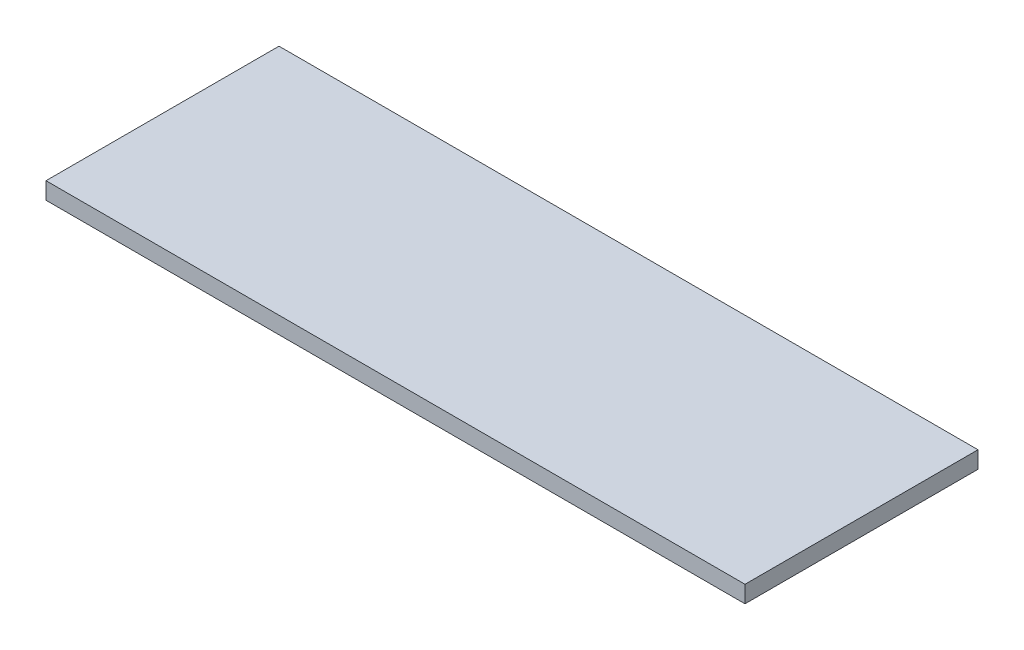
ISO-10303-21;
HEADER;
FILE_DESCRIPTION(('STEP AP214'),'2;1');
FILE_NAME('part.step','',(''),(''),'','','');
FILE_SCHEMA(('AUTOMOTIVE_DESIGN { 1 0 10303 214 1 1 1 1 }'));
ENDSEC;
DATA;
#1=APPLICATION_CONTEXT('core data for automotive mechanical design processes');
#2=APPLICATION_PROTOCOL_DEFINITION('international standard','automotive_design',2000,#1);
#3=PRODUCT_CONTEXT('',#1,'mechanical');
#4=PRODUCT('Part','Part','',(#3));
#5=PRODUCT_RELATED_PRODUCT_CATEGORY('part','',(#4));
#6=PRODUCT_DEFINITION_FORMATION('','',#4);
#7=PRODUCT_DEFINITION_CONTEXT('part definition',#1,'design');
#8=PRODUCT_DEFINITION('design','',#6,#7);
#9=PRODUCT_DEFINITION_SHAPE('','',#8);
#10=(LENGTH_UNIT() NAMED_UNIT(*) SI_UNIT(.MILLI.,.METRE.));
#11=(NAMED_UNIT(*) PLANE_ANGLE_UNIT() SI_UNIT($,.RADIAN.));
#12=(NAMED_UNIT(*) SI_UNIT($,.STERADIAN.) SOLID_ANGLE_UNIT());
#13=UNCERTAINTY_MEASURE_WITH_UNIT(LENGTH_MEASURE(1.E-05),#10,'distance_accuracy_value','');
#14=(GEOMETRIC_REPRESENTATION_CONTEXT(3) GLOBAL_UNCERTAINTY_ASSIGNED_CONTEXT((#13)) GLOBAL_UNIT_ASSIGNED_CONTEXT((#10,
#11,#12)) REPRESENTATION_CONTEXT('',''));
#15=CARTESIAN_POINT('',(0.,0.,0.));
#16=DIRECTION('',(0.,0.,1.));
#17=DIRECTION('',(1.,0.,0.));
#18=AXIS2_PLACEMENT_3D('',#15,#16,#17);
#19=CARTESIAN_POINT('',(33.,1.6,11.));
#20=DIRECTION('',(-1.,0.,0.));
#21=DIRECTION('',(0.,0.,1.));
#22=AXIS2_PLACEMENT_3D('',#19,#20,#21);
#23=PLANE('',#22);
#24=DIRECTION('',(0.,0.,-1.));
#25=VECTOR('',#24,1.);
#26=CARTESIAN_POINT('',(33.,0.,11.));
#27=LINE('',#26,#25);
#28=CARTESIAN_POINT('',(33.,0.,11.));
#29=VERTEX_POINT('',#28);
#30=CARTESIAN_POINT('',(33.,0.,-11.));
#31=VERTEX_POINT('',#30);
#32=EDGE_CURVE('E109',#29,#31,#27,.T.);
#33=ORIENTED_EDGE('',*,*,#32,.T.);
#34=DIRECTION('',(0.,-1.,0.));
#35=VECTOR('',#34,1.);
#36=CARTESIAN_POINT('',(33.,1.6,-11.));
#37=LINE('',#36,#35);
#38=CARTESIAN_POINT('',(33.,1.6,-11.));
#39=VERTEX_POINT('',#38);
#40=EDGE_CURVE('E11',#39,#31,#37,.T.);
#41=ORIENTED_EDGE('',*,*,#40,.F.);
#42=DIRECTION('',(0.,0.,-1.));
#43=VECTOR('',#42,1.);
#44=CARTESIAN_POINT('',(33.,1.6,11.));
#45=LINE('',#44,#43);
#46=CARTESIAN_POINT('',(33.,1.6,11.));
#47=VERTEX_POINT('',#46);
#48=EDGE_CURVE('E93',#47,#39,#45,.T.);
#49=ORIENTED_EDGE('',*,*,#48,.F.);
#50=DIRECTION('',(0.,-1.,0.));
#51=VECTOR('',#50,1.);
#52=CARTESIAN_POINT('',(33.,1.6,11.));
#53=LINE('',#52,#51);
#54=EDGE_CURVE('E105',#47,#29,#53,.T.);
#55=ORIENTED_EDGE('',*,*,#54,.T.);
#56=EDGE_LOOP('',(#33,#41,#49,#55));
#57=FACE_BOUND('',#56,.T.);
#58=ADVANCED_FACE('F41',(#57),#23,.F.);
#59=CARTESIAN_POINT('',(-33.,1.6,-11.));
#60=DIRECTION('',(0.,0.,1.));
#61=DIRECTION('',(1.,0.,0.));
#62=AXIS2_PLACEMENT_3D('',#59,#60,#61);
#63=PLANE('',#62);
#64=DIRECTION('',(-1.,0.,0.));
#65=VECTOR('',#64,1.);
#66=CARTESIAN_POINT('',(-33.,0.,-11.));
#67=LINE('',#66,#65);
#68=CARTESIAN_POINT('',(-33.,0.,-11.));
#69=VERTEX_POINT('',#68);
#70=EDGE_CURVE('E98',#31,#69,#67,.T.);
#71=ORIENTED_EDGE('',*,*,#70,.T.);
#72=DIRECTION('',(0.,-1.,0.));
#73=VECTOR('',#72,1.);
#74=CARTESIAN_POINT('',(-33.,1.6,-11.));
#75=LINE('',#74,#73);
#76=CARTESIAN_POINT('',(-33.,1.6,-11.));
#77=VERTEX_POINT('',#76);
#78=EDGE_CURVE('E50',#77,#69,#75,.T.);
#79=ORIENTED_EDGE('',*,*,#78,.F.);
#80=DIRECTION('',(-1.,0.,0.));
#81=VECTOR('',#80,1.);
#82=CARTESIAN_POINT('',(-33.,1.6,-11.));
#83=LINE('',#82,#81);
#84=EDGE_CURVE('E88',#39,#77,#83,.T.);
#85=ORIENTED_EDGE('',*,*,#84,.F.);
#86=ORIENTED_EDGE('',*,*,#40,.T.);
#87=EDGE_LOOP('',(#71,#79,#85,#86));
#88=FACE_BOUND('',#87,.T.);
#89=ADVANCED_FACE('F97',(#88),#63,.F.);
#90=CARTESIAN_POINT('',(-33.,1.6,11.));
#91=DIRECTION('',(1.,0.,0.));
#92=DIRECTION('',(0.,0.,-1.));
#93=AXIS2_PLACEMENT_3D('',#90,#91,#92);
#94=PLANE('',#93);
#95=DIRECTION('',(0.,0.,1.));
#96=VECTOR('',#95,1.);
#97=CARTESIAN_POINT('',(-33.,0.,11.));
#98=LINE('',#97,#96);
#99=CARTESIAN_POINT('',(-33.,0.,11.));
#100=VERTEX_POINT('',#99);
#101=EDGE_CURVE('E75',#69,#100,#98,.T.);
#102=ORIENTED_EDGE('',*,*,#101,.T.);
#103=DIRECTION('',(0.,-1.,0.));
#104=VECTOR('',#103,1.);
#105=CARTESIAN_POINT('',(-33.,1.6,11.));
#106=LINE('',#105,#104);
#107=CARTESIAN_POINT('',(-33.,1.6,11.));
#108=VERTEX_POINT('',#107);
#109=EDGE_CURVE('E100',#108,#100,#106,.T.);
#110=ORIENTED_EDGE('',*,*,#109,.F.);
#111=DIRECTION('',(0.,0.,1.));
#112=VECTOR('',#111,1.);
#113=CARTESIAN_POINT('',(-33.,1.6,11.));
#114=LINE('',#113,#112);
#115=EDGE_CURVE('E91',#77,#108,#114,.T.);
#116=ORIENTED_EDGE('',*,*,#115,.F.);
#117=ORIENTED_EDGE('',*,*,#78,.T.);
#118=EDGE_LOOP('',(#102,#110,#116,#117));
#119=FACE_BOUND('',#118,.T.);
#120=ADVANCED_FACE('F101',(#119),#94,.F.);
#121=CARTESIAN_POINT('',(-33.,1.6,11.));
#122=DIRECTION('',(0.,0.,-1.));
#123=DIRECTION('',(-1.,0.,0.));
#124=AXIS2_PLACEMENT_3D('',#121,#122,#123);
#125=PLANE('',#124);
#126=DIRECTION('',(1.,0.,0.));
#127=VECTOR('',#126,1.);
#128=CARTESIAN_POINT('',(-33.,0.,11.));
#129=LINE('',#128,#127);
#130=EDGE_CURVE('E81',#100,#29,#129,.T.);
#131=ORIENTED_EDGE('',*,*,#130,.T.);
#132=ORIENTED_EDGE('',*,*,#54,.F.);
#133=DIRECTION('',(1.,0.,0.));
#134=VECTOR('',#133,1.);
#135=CARTESIAN_POINT('',(-33.,1.6,11.));
#136=LINE('',#135,#134);
#137=EDGE_CURVE('E58',#108,#47,#136,.T.);
#138=ORIENTED_EDGE('',*,*,#137,.F.);
#139=ORIENTED_EDGE('',*,*,#109,.T.);
#140=EDGE_LOOP('',(#131,#132,#138,#139));
#141=FACE_BOUND('',#140,.T.);
#142=ADVANCED_FACE('F122',(#141),#125,.F.);
#143=CARTESIAN_POINT('',(0.,1.6,0.));
#144=DIRECTION('',(0.,-1.,0.));
#145=DIRECTION('',(0.,0.,-1.));
#146=AXIS2_PLACEMENT_3D('',#143,#144,#145);
#147=PLANE('',#146);
#148=ORIENTED_EDGE('',*,*,#48,.T.);
#149=ORIENTED_EDGE('',*,*,#84,.T.);
#150=ORIENTED_EDGE('',*,*,#115,.T.);
#151=ORIENTED_EDGE('',*,*,#137,.T.);
#152=EDGE_LOOP('',(#148,#149,#150,#151));
#153=FACE_BOUND('',#152,.T.);
#154=ADVANCED_FACE('F89',(#153),#147,.F.);
#155=CARTESIAN_POINT('',(0.,0.,0.));
#156=DIRECTION('',(0.,-1.,0.));
#157=DIRECTION('',(0.,0.,-1.));
#158=AXIS2_PLACEMENT_3D('',#155,#156,#157);
#159=PLANE('',#158);
#160=ORIENTED_EDGE('',*,*,#32,.F.);
#161=ORIENTED_EDGE('',*,*,#130,.F.);
#162=ORIENTED_EDGE('',*,*,#101,.F.);
#163=ORIENTED_EDGE('',*,*,#70,.F.);
#164=EDGE_LOOP('',(#160,#161,#162,#163));
#165=FACE_BOUND('',#164,.T.);
#166=ADVANCED_FACE('F125',(#165),#159,.T.);
#167=CLOSED_SHELL('',(#58,#89,#120,#142,#154,#166));
#168=MANIFOLD_SOLID_BREP('B2',#167);
#169=ADVANCED_BREP_SHAPE_REPRESENTATION('',(#18,#168),#14);
#170=SHAPE_DEFINITION_REPRESENTATION(#9,#169);
ENDSEC;
END-ISO-10303-21;
